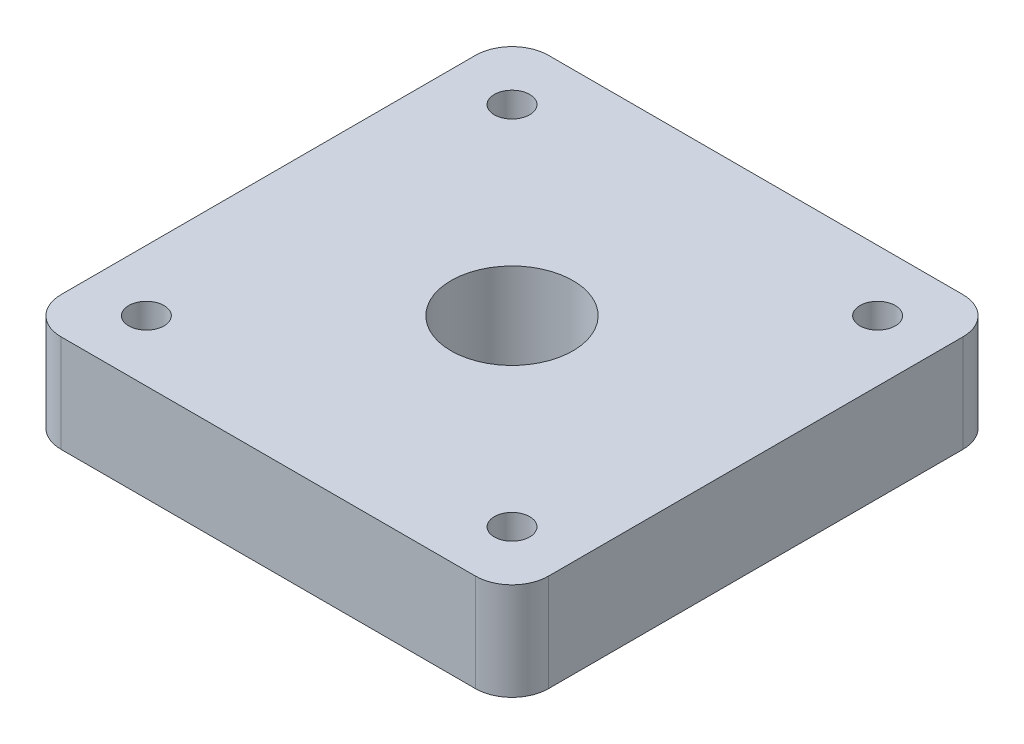
ISO-10303-21;
HEADER;
FILE_DESCRIPTION(('STEP AP214'),'2;1');
FILE_NAME('part.step','',(''),(''),'','','');
FILE_SCHEMA(('AUTOMOTIVE_DESIGN { 1 0 10303 214 1 1 1 1 }'));
ENDSEC;
DATA;
#1=APPLICATION_CONTEXT('core data for automotive mechanical design processes');
#2=APPLICATION_PROTOCOL_DEFINITION('international standard','automotive_design',2000,#1);
#3=PRODUCT_CONTEXT('',#1,'mechanical');
#4=PRODUCT('Part','Part','',(#3));
#5=PRODUCT_RELATED_PRODUCT_CATEGORY('part','',(#4));
#6=PRODUCT_DEFINITION_FORMATION('','',#4);
#7=PRODUCT_DEFINITION_CONTEXT('part definition',#1,'design');
#8=PRODUCT_DEFINITION('design','',#6,#7);
#9=PRODUCT_DEFINITION_SHAPE('','',#8);
#10=(LENGTH_UNIT() NAMED_UNIT(*) SI_UNIT(.MILLI.,.METRE.));
#11=(NAMED_UNIT(*) PLANE_ANGLE_UNIT() SI_UNIT($,.RADIAN.));
#12=(NAMED_UNIT(*) SI_UNIT($,.STERADIAN.) SOLID_ANGLE_UNIT());
#13=UNCERTAINTY_MEASURE_WITH_UNIT(LENGTH_MEASURE(1.E-05),#10,'distance_accuracy_value','');
#14=(GEOMETRIC_REPRESENTATION_CONTEXT(3) GLOBAL_UNCERTAINTY_ASSIGNED_CONTEXT((#13)) GLOBAL_UNIT_ASSIGNED_CONTEXT((#10,
#11,#12)) REPRESENTATION_CONTEXT('',''));
#15=CARTESIAN_POINT('',(0.,0.,0.));
#16=DIRECTION('',(0.,0.,1.));
#17=DIRECTION('',(1.,0.,0.));
#18=AXIS2_PLACEMENT_3D('',#15,#16,#17);
#19=CARTESIAN_POINT('',(0.,8.,0.));
#20=DIRECTION('',(0.,1.,0.));
#21=DIRECTION('',(0.,0.,1.));
#22=AXIS2_PLACEMENT_3D('',#19,#20,#21);
#23=PLANE('',#22);
#24=CARTESIAN_POINT('',(5.,8.,34.8885793871866));
#25=DIRECTION('',(0.,1.,0.));
#26=DIRECTION('',(0.,0.,1.));
#27=AXIS2_PLACEMENT_3D('',#24,#25,#26);
#28=CIRCLE('',#27,1.45);
#29=CARTESIAN_POINT('',(5.,8.,36.3385793871866));
#30=VERTEX_POINT('',#29);
#31=EDGE_CURVE('E194',#30,#30,#28,.T.);
#32=ORIENTED_EDGE('',*,*,#31,.F.);
#33=EDGE_LOOP('',(#32));
#34=FACE_BOUND('',#33,.T.);
#35=CARTESIAN_POINT('',(35.,8.,34.8885793871866));
#36=DIRECTION('',(0.,1.,0.));
#37=DIRECTION('',(0.,0.,1.));
#38=AXIS2_PLACEMENT_3D('',#35,#36,#37);
#39=CIRCLE('',#38,1.45);
#40=CARTESIAN_POINT('',(35.,8.,36.3385793871866));
#41=VERTEX_POINT('',#40);
#42=EDGE_CURVE('E200',#41,#41,#39,.T.);
#43=ORIENTED_EDGE('',*,*,#42,.F.);
#44=EDGE_LOOP('',(#43));
#45=FACE_BOUND('',#44,.T.);
#46=CARTESIAN_POINT('',(35.,8.,4.88857938718663));
#47=DIRECTION('',(0.,1.,0.));
#48=DIRECTION('',(0.,0.,1.));
#49=AXIS2_PLACEMENT_3D('',#46,#47,#48);
#50=CIRCLE('',#49,1.45);
#51=CARTESIAN_POINT('',(35.,8.,6.33857938718663));
#52=VERTEX_POINT('',#51);
#53=EDGE_CURVE('E206',#52,#52,#50,.T.);
#54=ORIENTED_EDGE('',*,*,#53,.F.);
#55=EDGE_LOOP('',(#54));
#56=FACE_BOUND('',#55,.T.);
#57=CARTESIAN_POINT('',(5.,8.,4.88857938718664));
#58=DIRECTION('',(0.,1.,0.));
#59=DIRECTION('',(0.,0.,1.));
#60=AXIS2_PLACEMENT_3D('',#57,#58,#59);
#61=CIRCLE('',#60,1.45);
#62=CARTESIAN_POINT('',(5.,8.,6.33857938718664));
#63=VERTEX_POINT('',#62);
#64=EDGE_CURVE('E188',#63,#63,#61,.T.);
#65=ORIENTED_EDGE('',*,*,#64,.F.);
#66=EDGE_LOOP('',(#65));
#67=FACE_BOUND('',#66,.T.);
#68=DIRECTION('',(1.,0.,0.));
#69=VECTOR('',#68,1.);
#70=CARTESIAN_POINT('',(0.,8.,39.8885793871866));
#71=LINE('',#70,#69);
#72=CARTESIAN_POINT('',(3.,8.,39.8885793871866));
#73=VERTEX_POINT('',#72);
#74=CARTESIAN_POINT('',(37.,8.,39.8885793871866));
#75=VERTEX_POINT('',#74);
#76=EDGE_CURVE('E172',#73,#75,#71,.T.);
#77=ORIENTED_EDGE('',*,*,#76,.T.);
#78=CARTESIAN_POINT('',(37.,8.,36.8885793871866));
#79=DIRECTION('',(0.,1.,0.));
#80=DIRECTION('',(0.,0.,1.));
#81=AXIS2_PLACEMENT_3D('',#78,#79,#80);
#82=CIRCLE('',#81,3.);
#83=CARTESIAN_POINT('',(40.,8.,36.8885793871866));
#84=VERTEX_POINT('',#83);
#85=EDGE_CURVE('E153',#75,#84,#82,.T.);
#86=ORIENTED_EDGE('',*,*,#85,.T.);
#87=DIRECTION('',(0.,0.,-1.));
#88=VECTOR('',#87,1.);
#89=CARTESIAN_POINT('',(40.,8.,-0.111420612813364));
#90=LINE('',#89,#88);
#91=CARTESIAN_POINT('',(40.,8.,2.88857938718664));
#92=VERTEX_POINT('',#91);
#93=EDGE_CURVE('E123',#84,#92,#90,.T.);
#94=ORIENTED_EDGE('',*,*,#93,.T.);
#95=CARTESIAN_POINT('',(37.,8.,2.88857938718664));
#96=DIRECTION('',(0.,1.,0.));
#97=DIRECTION('',(0.,0.,1.));
#98=AXIS2_PLACEMENT_3D('',#95,#96,#97);
#99=CIRCLE('',#98,3.);
#100=CARTESIAN_POINT('',(37.,8.,-0.111420612813364));
#101=VERTEX_POINT('',#100);
#102=EDGE_CURVE('E59',#92,#101,#99,.T.);
#103=ORIENTED_EDGE('',*,*,#102,.T.);
#104=DIRECTION('',(-1.,0.,0.));
#105=VECTOR('',#104,1.);
#106=CARTESIAN_POINT('',(0.,8.,-0.111420612813364));
#107=LINE('',#106,#105);
#108=CARTESIAN_POINT('',(3.,8.,-0.111420612813364));
#109=VERTEX_POINT('',#108);
#110=EDGE_CURVE('E139',#101,#109,#107,.T.);
#111=ORIENTED_EDGE('',*,*,#110,.T.);
#112=CARTESIAN_POINT('',(3.,8.,2.88857938718664));
#113=DIRECTION('',(0.,1.,0.));
#114=DIRECTION('',(0.,0.,1.));
#115=AXIS2_PLACEMENT_3D('',#112,#113,#114);
#116=CIRCLE('',#115,3.);
#117=CARTESIAN_POINT('',(0.,8.,2.88857938718664));
#118=VERTEX_POINT('',#117);
#119=EDGE_CURVE('E150',#109,#118,#116,.T.);
#120=ORIENTED_EDGE('',*,*,#119,.T.);
#121=DIRECTION('',(0.,0.,1.));
#122=VECTOR('',#121,1.);
#123=CARTESIAN_POINT('',(0.,8.,-0.111420612813364));
#124=LINE('',#123,#122);
#125=CARTESIAN_POINT('',(0.,8.,36.8885793871866));
#126=VERTEX_POINT('',#125);
#127=EDGE_CURVE('E133',#118,#126,#124,.T.);
#128=ORIENTED_EDGE('',*,*,#127,.T.);
#129=CARTESIAN_POINT('',(3.,8.,36.8885793871866));
#130=DIRECTION('',(0.,1.,0.));
#131=DIRECTION('',(0.,0.,1.));
#132=AXIS2_PLACEMENT_3D('',#129,#130,#131);
#133=CIRCLE('',#132,3.);
#134=EDGE_CURVE('E148',#126,#73,#133,.T.);
#135=ORIENTED_EDGE('',*,*,#134,.T.);
#136=EDGE_LOOP('',(#77,#86,#94,#103,#111,#120,#128,#135));
#137=FACE_BOUND('',#136,.T.);
#138=CARTESIAN_POINT('',(20.,8.,19.8885793871866));
#139=DIRECTION('',(0.,1.,0.));
#140=DIRECTION('',(0.,0.,1.));
#141=AXIS2_PLACEMENT_3D('',#138,#139,#140);
#142=CIRCLE('',#141,5.);
#143=CARTESIAN_POINT('',(20.,8.,24.8885793871866));
#144=VERTEX_POINT('',#143);
#145=EDGE_CURVE('E177',#144,#144,#142,.T.);
#146=ORIENTED_EDGE('',*,*,#145,.F.);
#147=EDGE_LOOP('',(#146));
#148=FACE_BOUND('',#147,.T.);
#149=ADVANCED_FACE('F37',(#34,#45,#56,#67,#137,#148),#23,.T.);
#150=CARTESIAN_POINT('',(0.,0.,0.));
#151=DIRECTION('',(0.,1.,0.));
#152=DIRECTION('',(0.,0.,1.));
#153=AXIS2_PLACEMENT_3D('',#150,#151,#152);
#154=PLANE('',#153);
#155=CARTESIAN_POINT('',(5.,0.,34.8885793871866));
#156=DIRECTION('',(0.,1.,0.));
#157=DIRECTION('',(0.,0.,1.));
#158=AXIS2_PLACEMENT_3D('',#155,#156,#157);
#159=CIRCLE('',#158,1.45);
#160=CARTESIAN_POINT('',(5.,0.,36.3385793871866));
#161=VERTEX_POINT('',#160);
#162=EDGE_CURVE('E197',#161,#161,#159,.T.);
#163=ORIENTED_EDGE('',*,*,#162,.T.);
#164=EDGE_LOOP('',(#163));
#165=FACE_BOUND('',#164,.T.);
#166=CARTESIAN_POINT('',(35.,0.,34.8885793871866));
#167=DIRECTION('',(0.,1.,0.));
#168=DIRECTION('',(0.,0.,1.));
#169=AXIS2_PLACEMENT_3D('',#166,#167,#168);
#170=CIRCLE('',#169,1.45);
#171=CARTESIAN_POINT('',(35.,0.,36.3385793871866));
#172=VERTEX_POINT('',#171);
#173=EDGE_CURVE('E203',#172,#172,#170,.T.);
#174=ORIENTED_EDGE('',*,*,#173,.T.);
#175=EDGE_LOOP('',(#174));
#176=FACE_BOUND('',#175,.T.);
#177=CARTESIAN_POINT('',(35.,0.,4.88857938718663));
#178=DIRECTION('',(0.,1.,0.));
#179=DIRECTION('',(0.,0.,1.));
#180=AXIS2_PLACEMENT_3D('',#177,#178,#179);
#181=CIRCLE('',#180,1.45);
#182=CARTESIAN_POINT('',(35.,0.,6.33857938718663));
#183=VERTEX_POINT('',#182);
#184=EDGE_CURVE('E191',#183,#183,#181,.T.);
#185=ORIENTED_EDGE('',*,*,#184,.T.);
#186=EDGE_LOOP('',(#185));
#187=FACE_BOUND('',#186,.T.);
#188=CARTESIAN_POINT('',(5.,0.,4.88857938718664));
#189=DIRECTION('',(0.,1.,0.));
#190=DIRECTION('',(0.,0.,1.));
#191=AXIS2_PLACEMENT_3D('',#188,#189,#190);
#192=CIRCLE('',#191,1.45);
#193=CARTESIAN_POINT('',(5.,0.,6.33857938718664));
#194=VERTEX_POINT('',#193);
#195=EDGE_CURVE('E186',#194,#194,#192,.T.);
#196=ORIENTED_EDGE('',*,*,#195,.T.);
#197=EDGE_LOOP('',(#196));
#198=FACE_BOUND('',#197,.T.);
#199=DIRECTION('',(0.,0.,-1.));
#200=VECTOR('',#199,1.);
#201=CARTESIAN_POINT('',(40.,0.,-0.111420612813364));
#202=LINE('',#201,#200);
#203=CARTESIAN_POINT('',(40.,0.,36.8885793871866));
#204=VERTEX_POINT('',#203);
#205=CARTESIAN_POINT('',(40.,0.,2.88857938718664));
#206=VERTEX_POINT('',#205);
#207=EDGE_CURVE('E121',#204,#206,#202,.T.);
#208=ORIENTED_EDGE('',*,*,#207,.F.);
#209=CARTESIAN_POINT('',(37.,0.,36.8885793871866));
#210=DIRECTION('',(0.,1.,0.));
#211=DIRECTION('',(0.,0.,1.));
#212=AXIS2_PLACEMENT_3D('',#209,#210,#211);
#213=CIRCLE('',#212,3.);
#214=CARTESIAN_POINT('',(37.,0.,39.8885793871866));
#215=VERTEX_POINT('',#214);
#216=EDGE_CURVE('E104',#204,#215,#213,.F.);
#217=ORIENTED_EDGE('',*,*,#216,.T.);
#218=DIRECTION('',(1.,0.,0.));
#219=VECTOR('',#218,1.);
#220=CARTESIAN_POINT('',(0.,0.,39.8885793871866));
#221=LINE('',#220,#219);
#222=CARTESIAN_POINT('',(3.,0.,39.8885793871866));
#223=VERTEX_POINT('',#222);
#224=EDGE_CURVE('E131',#223,#215,#221,.T.);
#225=ORIENTED_EDGE('',*,*,#224,.F.);
#226=CARTESIAN_POINT('',(3.,0.,36.8885793871866));
#227=DIRECTION('',(0.,1.,0.));
#228=DIRECTION('',(0.,0.,1.));
#229=AXIS2_PLACEMENT_3D('',#226,#227,#228);
#230=CIRCLE('',#229,3.);
#231=CARTESIAN_POINT('',(0.,0.,36.8885793871866));
#232=VERTEX_POINT('',#231);
#233=EDGE_CURVE('E124',#223,#232,#230,.F.);
#234=ORIENTED_EDGE('',*,*,#233,.T.);
#235=DIRECTION('',(0.,0.,1.));
#236=VECTOR('',#235,1.);
#237=CARTESIAN_POINT('',(0.,0.,-0.111420612813364));
#238=LINE('',#237,#236);
#239=CARTESIAN_POINT('',(0.,0.,2.88857938718664));
#240=VERTEX_POINT('',#239);
#241=EDGE_CURVE('E135',#240,#232,#238,.T.);
#242=ORIENTED_EDGE('',*,*,#241,.F.);
#243=CARTESIAN_POINT('',(3.,0.,2.88857938718664));
#244=DIRECTION('',(0.,1.,0.));
#245=DIRECTION('',(0.,0.,1.));
#246=AXIS2_PLACEMENT_3D('',#243,#244,#245);
#247=CIRCLE('',#246,3.);
#248=CARTESIAN_POINT('',(3.,0.,-0.111420612813364));
#249=VERTEX_POINT('',#248);
#250=EDGE_CURVE('E142',#240,#249,#247,.F.);
#251=ORIENTED_EDGE('',*,*,#250,.T.);
#252=DIRECTION('',(-1.,0.,0.));
#253=VECTOR('',#252,1.);
#254=CARTESIAN_POINT('',(0.,0.,-0.111420612813364));
#255=LINE('',#254,#253);
#256=CARTESIAN_POINT('',(37.,0.,-0.111420612813364));
#257=VERTEX_POINT('',#256);
#258=EDGE_CURVE('E130',#257,#249,#255,.T.);
#259=ORIENTED_EDGE('',*,*,#258,.F.);
#260=CARTESIAN_POINT('',(37.,0.,2.88857938718664));
#261=DIRECTION('',(0.,1.,0.));
#262=DIRECTION('',(0.,0.,1.));
#263=AXIS2_PLACEMENT_3D('',#260,#261,#262);
#264=CIRCLE('',#263,3.);
#265=EDGE_CURVE('E115',#257,#206,#264,.F.);
#266=ORIENTED_EDGE('',*,*,#265,.T.);
#267=EDGE_LOOP('',(#208,#217,#225,#234,#242,#251,#259,#266));
#268=FACE_BOUND('',#267,.T.);
#269=CARTESIAN_POINT('',(20.,0.,19.8885793871866));
#270=DIRECTION('',(0.,1.,0.));
#271=DIRECTION('',(0.,0.,1.));
#272=AXIS2_PLACEMENT_3D('',#269,#270,#271);
#273=CIRCLE('',#272,5.);
#274=CARTESIAN_POINT('',(20.,0.,24.8885793871866));
#275=VERTEX_POINT('',#274);
#276=EDGE_CURVE('E179',#275,#275,#273,.T.);
#277=ORIENTED_EDGE('',*,*,#276,.T.);
#278=EDGE_LOOP('',(#277));
#279=FACE_BOUND('',#278,.T.);
#280=ADVANCED_FACE('F127',(#165,#176,#187,#198,#268,#279),#154,.F.);
#281=CARTESIAN_POINT('',(0.,8.,-0.111420612813364));
#282=DIRECTION('',(1.,0.,0.));
#283=DIRECTION('',(0.,0.,-1.));
#284=AXIS2_PLACEMENT_3D('',#281,#282,#283);
#285=PLANE('',#284);
#286=ORIENTED_EDGE('',*,*,#127,.F.);
#287=DIRECTION('',(0.,-1.,0.));
#288=VECTOR('',#287,1.);
#289=CARTESIAN_POINT('',(0.,8.,2.88857938718664));
#290=LINE('',#289,#288);
#291=EDGE_CURVE('E11',#118,#240,#290,.T.);
#292=ORIENTED_EDGE('',*,*,#291,.T.);
#293=ORIENTED_EDGE('',*,*,#241,.T.);
#294=DIRECTION('',(0.,-1.,0.));
#295=VECTOR('',#294,1.);
#296=CARTESIAN_POINT('',(0.,8.,36.8885793871866));
#297=LINE('',#296,#295);
#298=EDGE_CURVE('E45',#232,#126,#297,.F.);
#299=ORIENTED_EDGE('',*,*,#298,.T.);
#300=EDGE_LOOP('',(#286,#292,#293,#299));
#301=FACE_BOUND('',#300,.T.);
#302=ADVANCED_FACE('F163',(#301),#285,.F.);
#303=CARTESIAN_POINT('',(0.,8.,39.8885793871866));
#304=DIRECTION('',(0.,0.,-1.));
#305=DIRECTION('',(-1.,0.,0.));
#306=AXIS2_PLACEMENT_3D('',#303,#304,#305);
#307=PLANE('',#306);
#308=ORIENTED_EDGE('',*,*,#224,.T.);
#309=DIRECTION('',(0.,-1.,0.));
#310=VECTOR('',#309,1.);
#311=CARTESIAN_POINT('',(37.,8.,39.8885793871866));
#312=LINE('',#311,#310);
#313=EDGE_CURVE('E109',#215,#75,#312,.F.);
#314=ORIENTED_EDGE('',*,*,#313,.T.);
#315=ORIENTED_EDGE('',*,*,#76,.F.);
#316=DIRECTION('',(0.,-1.,0.));
#317=VECTOR('',#316,1.);
#318=CARTESIAN_POINT('',(3.,8.,39.8885793871866));
#319=LINE('',#318,#317);
#320=EDGE_CURVE('E114',#73,#223,#319,.T.);
#321=ORIENTED_EDGE('',*,*,#320,.T.);
#322=EDGE_LOOP('',(#308,#314,#315,#321));
#323=FACE_BOUND('',#322,.T.);
#324=ADVANCED_FACE('F176',(#323),#307,.F.);
#325=CARTESIAN_POINT('',(40.,8.,-0.111420612813364));
#326=DIRECTION('',(-1.,0.,0.));
#327=DIRECTION('',(0.,0.,1.));
#328=AXIS2_PLACEMENT_3D('',#325,#326,#327);
#329=PLANE('',#328);
#330=ORIENTED_EDGE('',*,*,#93,.F.);
#331=DIRECTION('',(0.,-1.,0.));
#332=VECTOR('',#331,1.);
#333=CARTESIAN_POINT('',(40.,8.,36.8885793871866));
#334=LINE('',#333,#332);
#335=EDGE_CURVE('E108',#84,#204,#334,.T.);
#336=ORIENTED_EDGE('',*,*,#335,.T.);
#337=ORIENTED_EDGE('',*,*,#207,.T.);
#338=DIRECTION('',(0.,-1.,0.));
#339=VECTOR('',#338,1.);
#340=CARTESIAN_POINT('',(40.,8.,2.88857938718664));
#341=LINE('',#340,#339);
#342=EDGE_CURVE('E125',#206,#92,#341,.F.);
#343=ORIENTED_EDGE('',*,*,#342,.T.);
#344=EDGE_LOOP('',(#330,#336,#337,#343));
#345=FACE_BOUND('',#344,.T.);
#346=ADVANCED_FACE('F120',(#345),#329,.F.);
#347=CARTESIAN_POINT('',(0.,8.,-0.111420612813364));
#348=DIRECTION('',(0.,0.,1.));
#349=DIRECTION('',(1.,0.,0.));
#350=AXIS2_PLACEMENT_3D('',#347,#348,#349);
#351=PLANE('',#350);
#352=ORIENTED_EDGE('',*,*,#110,.F.);
#353=DIRECTION('',(0.,-1.,0.));
#354=VECTOR('',#353,1.);
#355=CARTESIAN_POINT('',(37.,8.,-0.111420612813364));
#356=LINE('',#355,#354);
#357=EDGE_CURVE('E156',#101,#257,#356,.T.);
#358=ORIENTED_EDGE('',*,*,#357,.T.);
#359=ORIENTED_EDGE('',*,*,#258,.T.);
#360=DIRECTION('',(0.,-1.,0.));
#361=VECTOR('',#360,1.);
#362=CARTESIAN_POINT('',(3.,8.,-0.111420612813364));
#363=LINE('',#362,#361);
#364=EDGE_CURVE('E52',#249,#109,#363,.F.);
#365=ORIENTED_EDGE('',*,*,#364,.T.);
#366=EDGE_LOOP('',(#352,#358,#359,#365));
#367=FACE_BOUND('',#366,.T.);
#368=ADVANCED_FACE('F235',(#367),#351,.F.);
#369=CARTESIAN_POINT('',(20.,8.,19.8885793871866));
#370=DIRECTION('',(0.,-1.,0.));
#371=DIRECTION('',(0.,0.,-1.));
#372=AXIS2_PLACEMENT_3D('',#369,#370,#371);
#373=CYLINDRICAL_SURFACE('',#372,5.);
#374=ORIENTED_EDGE('',*,*,#145,.T.);
#375=EDGE_LOOP('',(#374));
#376=FACE_BOUND('',#375,.T.);
#377=ORIENTED_EDGE('',*,*,#276,.F.);
#378=EDGE_LOOP('',(#377));
#379=FACE_BOUND('',#378,.T.);
#380=ADVANCED_FACE('F229',(#376,#379),#373,.F.);
#381=CARTESIAN_POINT('',(5.,0.,4.88857938718664));
#382=DIRECTION('',(0.,1.,0.));
#383=DIRECTION('',(0.,0.,1.));
#384=AXIS2_PLACEMENT_3D('',#381,#382,#383);
#385=CYLINDRICAL_SURFACE('',#384,1.45);
#386=ORIENTED_EDGE('',*,*,#195,.F.);
#387=EDGE_LOOP('',(#386));
#388=FACE_BOUND('',#387,.T.);
#389=ORIENTED_EDGE('',*,*,#64,.T.);
#390=EDGE_LOOP('',(#389));
#391=FACE_BOUND('',#390,.T.);
#392=ADVANCED_FACE('F218',(#388,#391),#385,.F.);
#393=CARTESIAN_POINT('',(35.,0.,4.88857938718663));
#394=DIRECTION('',(0.,1.,0.));
#395=DIRECTION('',(0.,0.,1.));
#396=AXIS2_PLACEMENT_3D('',#393,#394,#395);
#397=CYLINDRICAL_SURFACE('',#396,1.45);
#398=ORIENTED_EDGE('',*,*,#184,.F.);
#399=EDGE_LOOP('',(#398));
#400=FACE_BOUND('',#399,.T.);
#401=ORIENTED_EDGE('',*,*,#53,.T.);
#402=EDGE_LOOP('',(#401));
#403=FACE_BOUND('',#402,.T.);
#404=ADVANCED_FACE('F214',(#400,#403),#397,.F.);
#405=CARTESIAN_POINT('',(35.,0.,34.8885793871866));
#406=DIRECTION('',(0.,1.,0.));
#407=DIRECTION('',(0.,0.,1.));
#408=AXIS2_PLACEMENT_3D('',#405,#406,#407);
#409=CYLINDRICAL_SURFACE('',#408,1.45);
#410=ORIENTED_EDGE('',*,*,#173,.F.);
#411=EDGE_LOOP('',(#410));
#412=FACE_BOUND('',#411,.T.);
#413=ORIENTED_EDGE('',*,*,#42,.T.);
#414=EDGE_LOOP('',(#413));
#415=FACE_BOUND('',#414,.T.);
#416=ADVANCED_FACE('F217',(#412,#415),#409,.F.);
#417=CARTESIAN_POINT('',(5.,0.,34.8885793871866));
#418=DIRECTION('',(0.,1.,0.));
#419=DIRECTION('',(0.,0.,1.));
#420=AXIS2_PLACEMENT_3D('',#417,#418,#419);
#421=CYLINDRICAL_SURFACE('',#420,1.45);
#422=ORIENTED_EDGE('',*,*,#162,.F.);
#423=EDGE_LOOP('',(#422));
#424=FACE_BOUND('',#423,.T.);
#425=ORIENTED_EDGE('',*,*,#31,.T.);
#426=EDGE_LOOP('',(#425));
#427=FACE_BOUND('',#426,.T.);
#428=ADVANCED_FACE('F240',(#424,#427),#421,.F.);
#429=CARTESIAN_POINT('',(37.,8.,36.8885793871866));
#430=DIRECTION('',(0.,-1.,0.));
#431=DIRECTION('',(0.,0.,-1.));
#432=AXIS2_PLACEMENT_3D('',#429,#430,#431);
#433=CYLINDRICAL_SURFACE('',#432,3.);
#434=ORIENTED_EDGE('',*,*,#85,.F.);
#435=ORIENTED_EDGE('',*,*,#313,.F.);
#436=ORIENTED_EDGE('',*,*,#216,.F.);
#437=ORIENTED_EDGE('',*,*,#335,.F.);
#438=EDGE_LOOP('',(#434,#435,#436,#437));
#439=FACE_BOUND('',#438,.T.);
#440=ADVANCED_FACE('F107',(#439),#433,.T.);
#441=CARTESIAN_POINT('',(37.,8.,2.88857938718664));
#442=DIRECTION('',(0.,-1.,0.));
#443=DIRECTION('',(0.,0.,-1.));
#444=AXIS2_PLACEMENT_3D('',#441,#442,#443);
#445=CYLINDRICAL_SURFACE('',#444,3.);
#446=ORIENTED_EDGE('',*,*,#102,.F.);
#447=ORIENTED_EDGE('',*,*,#342,.F.);
#448=ORIENTED_EDGE('',*,*,#265,.F.);
#449=ORIENTED_EDGE('',*,*,#357,.F.);
#450=EDGE_LOOP('',(#446,#447,#448,#449));
#451=FACE_BOUND('',#450,.T.);
#452=ADVANCED_FACE('F256',(#451),#445,.T.);
#453=CARTESIAN_POINT('',(3.,8.,2.88857938718664));
#454=DIRECTION('',(0.,-1.,0.));
#455=DIRECTION('',(0.,0.,-1.));
#456=AXIS2_PLACEMENT_3D('',#453,#454,#455);
#457=CYLINDRICAL_SURFACE('',#456,3.);
#458=ORIENTED_EDGE('',*,*,#119,.F.);
#459=ORIENTED_EDGE('',*,*,#364,.F.);
#460=ORIENTED_EDGE('',*,*,#250,.F.);
#461=ORIENTED_EDGE('',*,*,#291,.F.);
#462=EDGE_LOOP('',(#458,#459,#460,#461));
#463=FACE_BOUND('',#462,.T.);
#464=ADVANCED_FACE('F258',(#463),#457,.T.);
#465=CARTESIAN_POINT('',(3.,8.,36.8885793871866));
#466=DIRECTION('',(0.,-1.,0.));
#467=DIRECTION('',(0.,0.,-1.));
#468=AXIS2_PLACEMENT_3D('',#465,#466,#467);
#469=CYLINDRICAL_SURFACE('',#468,3.);
#470=ORIENTED_EDGE('',*,*,#134,.F.);
#471=ORIENTED_EDGE('',*,*,#298,.F.);
#472=ORIENTED_EDGE('',*,*,#233,.F.);
#473=ORIENTED_EDGE('',*,*,#320,.F.);
#474=EDGE_LOOP('',(#470,#471,#472,#473));
#475=FACE_BOUND('',#474,.T.);
#476=ADVANCED_FACE('F39',(#475),#469,.T.);
#477=CLOSED_SHELL('',(#149,#280,#302,#324,#346,#368,#380,#392,#404,#416,#428,#440,#452,#464,#476));
#478=MANIFOLD_SOLID_BREP('B2',#477);
#479=ADVANCED_BREP_SHAPE_REPRESENTATION('',(#18,#478),#14);
#480=SHAPE_DEFINITION_REPRESENTATION(#9,#479);
ENDSEC;
END-ISO-10303-21;
